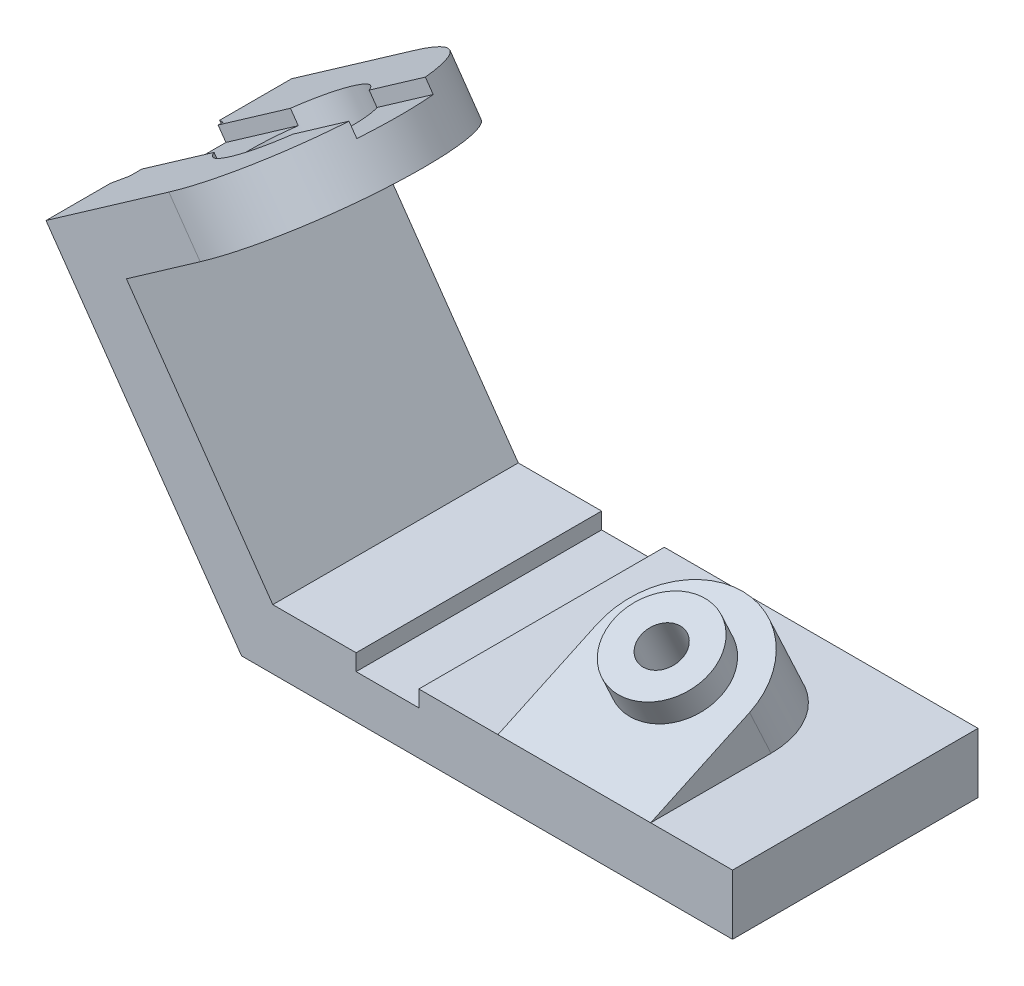
ISO-10303-21;
HEADER;
FILE_DESCRIPTION(('STEP AP214'),'2;1');
FILE_NAME('part.step','',(''),(''),'','','');
FILE_SCHEMA(('AUTOMOTIVE_DESIGN { 1 0 10303 214 1 1 1 1 }'));
ENDSEC;
DATA;
#1=APPLICATION_CONTEXT('core data for automotive mechanical design processes');
#2=APPLICATION_PROTOCOL_DEFINITION('international standard','automotive_design',2000,#1);
#3=PRODUCT_CONTEXT('',#1,'mechanical');
#4=PRODUCT('Part','Part','',(#3));
#5=PRODUCT_RELATED_PRODUCT_CATEGORY('part','',(#4));
#6=PRODUCT_DEFINITION_FORMATION('','',#4);
#7=PRODUCT_DEFINITION_CONTEXT('part definition',#1,'design');
#8=PRODUCT_DEFINITION('design','',#6,#7);
#9=PRODUCT_DEFINITION_SHAPE('','',#8);
#10=(LENGTH_UNIT() NAMED_UNIT(*) SI_UNIT(.MILLI.,.METRE.));
#11=(NAMED_UNIT(*) PLANE_ANGLE_UNIT() SI_UNIT($,.RADIAN.));
#12=(NAMED_UNIT(*) SI_UNIT($,.STERADIAN.) SOLID_ANGLE_UNIT());
#13=UNCERTAINTY_MEASURE_WITH_UNIT(LENGTH_MEASURE(1.E-05),#10,'distance_accuracy_value','');
#14=(GEOMETRIC_REPRESENTATION_CONTEXT(3) GLOBAL_UNCERTAINTY_ASSIGNED_CONTEXT((#13)) GLOBAL_UNIT_ASSIGNED_CONTEXT((#10,
#11,#12)) REPRESENTATION_CONTEXT('',''));
#15=CARTESIAN_POINT('',(0.,0.,0.));
#16=DIRECTION('',(0.,0.,1.));
#17=DIRECTION('',(1.,0.,0.));
#18=AXIS2_PLACEMENT_3D('',#15,#16,#17);
#19=CARTESIAN_POINT('',(-143.675709569523,115.012687135847,-45.));
#20=DIRECTION('',(-0.57357643635105,0.819152044288989,0.));
#21=DIRECTION('',(-0.819152044288989,-0.57357643635105,0.));
#22=AXIS2_PLACEMENT_3D('',#19,#20,#21);
#23=PLANE('',#22);
#24=DIRECTION('',(0.,0.,-1.));
#25=VECTOR('',#24,1.);
#26=CARTESIAN_POINT('',(-157.601294322436,105.261887717879,-15.7753642615069));
#27=LINE('',#26,#25);
#28=CARTESIAN_POINT('',(-157.601294322436,105.261887717879,-14.));
#29=VERTEX_POINT('',#28);
#30=CARTESIAN_POINT('',(-157.601294322436,105.261887717879,-15.7753642615069));
#31=VERTEX_POINT('',#30);
#32=EDGE_CURVE('E339',#29,#31,#27,.T.);
#33=ORIENTED_EDGE('',*,*,#32,.F.);
#34=DIRECTION('',(0.819152044288989,0.57357643635105,0.));
#35=VECTOR('',#34,1.);
#36=CARTESIAN_POINT('',(-101.306148094227,144.68017347149,-14.));
#37=LINE('',#36,#35);
#38=CARTESIAN_POINT('',(-131.072166550332,123.837782966035,-14.));
#39=VERTEX_POINT('',#38);
#40=EDGE_CURVE('E241',#29,#39,#37,.T.);
#41=ORIENTED_EDGE('',*,*,#40,.T.);
#42=CARTESIAN_POINT('',(-116.643692107987,133.940709535431,0.));
#43=DIRECTION('',(-0.573576436351042,0.819152044288995,0.));
#44=DIRECTION('',(-0.819152044288995,-0.573576436351042,0.));
#45=AXIS2_PLACEMENT_3D('',#42,#43,#44);
#46=CIRCLE('',#45,22.5);
#47=CARTESIAN_POINT('',(-102.215217665642,144.043636104827,-14.));
#48=VERTEX_POINT('',#47);
#49=EDGE_CURVE('E294',#48,#39,#46,.T.);
#50=ORIENTED_EDGE('',*,*,#49,.F.);
#51=DIRECTION('',(0.819152044288989,0.57357643635105,0.));
#52=VECTOR('',#51,1.);
#53=CARTESIAN_POINT('',(-101.306148094227,144.68017347149,-14.));
#54=LINE('',#53,#52);
#55=CARTESIAN_POINT('',(-81.6111726286328,158.470743757354,-14.));
#56=VERTEX_POINT('',#55);
#57=EDGE_CURVE('E260',#48,#56,#54,.T.);
#58=ORIENTED_EDGE('',*,*,#57,.T.);
#59=CARTESIAN_POINT('',(-116.643692107987,133.940709535431,0.));
#60=DIRECTION('',(-0.573576436351042,0.819152044288995,0.));
#61=DIRECTION('',(-0.819152044288995,-0.573576436351042,0.));
#62=AXIS2_PLACEMENT_3D('',#59,#60,#61);
#63=CIRCLE('',#62,45.);
#64=CARTESIAN_POINT('',(-116.643692107987,133.940709535431,-45.));
#65=VERTEX_POINT('',#64);
#66=EDGE_CURVE('E309',#65,#56,#63,.F.);
#67=ORIENTED_EDGE('',*,*,#66,.F.);
#68=DIRECTION('',(-0.819152044288989,-0.57357643635105,0.));
#69=VECTOR('',#68,1.);
#70=CARTESIAN_POINT('',(-143.675709569523,115.012687135847,-45.));
#71=LINE('',#70,#69);
#72=CARTESIAN_POINT('',(-161.697054543881,102.394005536124,-45.));
#73=VERTEX_POINT('',#72);
#74=EDGE_CURVE('E384',#65,#73,#71,.T.);
#75=ORIENTED_EDGE('',*,*,#74,.T.);
#76=DIRECTION('',(0.,0.,-1.));
#77=VECTOR('',#76,1.);
#78=CARTESIAN_POINT('',(-161.697054543881,102.394005536124,-45.));
#79=LINE('',#78,#77);
#80=CARTESIAN_POINT('',(-161.697054543881,102.394005536124,-18.662115607455));
#81=VERTEX_POINT('',#80);
#82=EDGE_CURVE('E377',#81,#73,#79,.T.);
#83=ORIENTED_EDGE('',*,*,#82,.F.);
#84=DIRECTION('',(-0.709406479916221,-0.496731764892155,-0.500000000000001));
#85=VECTOR('',#84,1.);
#86=CARTESIAN_POINT('',(-161.697054543881,102.394005536124,-18.662115607455));
#87=LINE('',#86,#85);
#88=EDGE_CURVE('E342',#31,#81,#87,.T.);
#89=ORIENTED_EDGE('',*,*,#88,.F.);
#90=EDGE_LOOP('',(#33,#41,#50,#58,#67,#75,#83,#89));
#91=FACE_BOUND('',#90,.T.);
#92=ADVANCED_FACE('F44',(#91),#23,.T.);
#93=DIRECTION('',(0.819152044288989,0.57357643635105,0.));
#94=VECTOR('',#93,1.);
#95=CARTESIAN_POINT('',(-101.306148094227,144.68017347149,14.));
#96=LINE('',#95,#94);
#97=CARTESIAN_POINT('',(-157.601294322436,105.261887717879,14.));
#98=VERTEX_POINT('',#97);
#99=CARTESIAN_POINT('',(-131.072166550331,123.837782966035,14.));
#100=VERTEX_POINT('',#99);
#101=EDGE_CURVE('E280',#98,#100,#96,.T.);
#102=ORIENTED_EDGE('',*,*,#101,.F.);
#103=CARTESIAN_POINT('',(-157.601294322436,105.261887717879,18.4511330465968));
#104=VERTEX_POINT('',#103);
#105=EDGE_CURVE('E246',#104,#98,#27,.T.);
#106=ORIENTED_EDGE('',*,*,#105,.F.);
#107=DIRECTION('',(0.709406479916222,0.496731764892155,-0.500000000000001));
#108=VECTOR('',#107,1.);
#109=CARTESIAN_POINT('',(-157.601294322436,105.261887717879,18.4511330465968));
#110=LINE('',#109,#108);
#111=CARTESIAN_POINT('',(-161.697054543881,102.394005536124,21.337884392545));
#112=VERTEX_POINT('',#111);
#113=EDGE_CURVE('E335',#112,#104,#110,.T.);
#114=ORIENTED_EDGE('',*,*,#113,.F.);
#115=CARTESIAN_POINT('',(-161.697054543881,102.394005536124,45.));
#116=VERTEX_POINT('',#115);
#117=EDGE_CURVE('E378',#116,#112,#79,.T.);
#118=ORIENTED_EDGE('',*,*,#117,.F.);
#119=DIRECTION('',(-0.819152044288989,-0.57357643635105,0.));
#120=VECTOR('',#119,1.);
#121=CARTESIAN_POINT('',(-143.675709569523,115.012687135847,45.));
#122=LINE('',#121,#120);
#123=CARTESIAN_POINT('',(-116.643692107986,133.940709535431,44.9999999999999));
#124=VERTEX_POINT('',#123);
#125=EDGE_CURVE('E374',#124,#116,#122,.T.);
#126=ORIENTED_EDGE('',*,*,#125,.F.);
#127=CARTESIAN_POINT('',(-81.6111726286329,158.470743757354,14.));
#128=VERTEX_POINT('',#127);
#129=EDGE_CURVE('E320',#128,#124,#63,.F.);
#130=ORIENTED_EDGE('',*,*,#129,.F.);
#131=DIRECTION('',(0.819152044288989,0.57357643635105,0.));
#132=VECTOR('',#131,1.);
#133=CARTESIAN_POINT('',(-101.306148094227,144.68017347149,14.));
#134=LINE('',#133,#132);
#135=CARTESIAN_POINT('',(-102.215217665642,144.043636104827,14.));
#136=VERTEX_POINT('',#135);
#137=EDGE_CURVE('E270',#136,#128,#134,.T.);
#138=ORIENTED_EDGE('',*,*,#137,.F.);
#139=EDGE_CURVE('E316',#100,#136,#46,.T.);
#140=ORIENTED_EDGE('',*,*,#139,.F.);
#141=EDGE_LOOP('',(#102,#106,#114,#118,#126,#130,#138,#140));
#142=FACE_BOUND('',#141,.T.);
#143=ADVANCED_FACE('F566',(#142),#23,.T.);
#144=CARTESIAN_POINT('',(-26.6860526778643,-81.7044536889768,-15.7753642615069));
#145=DIRECTION('',(0.819152044288989,0.57357643635105,0.));
#146=DIRECTION('',(-0.57357643635105,0.819152044288989,0.));
#147=AXIS2_PLACEMENT_3D('',#144,#145,#146);
#148=PLANE('',#147);
#149=DIRECTION('',(-0.57357643635105,0.819152044288989,0.));
#150=VECTOR('',#149,1.);
#151=CARTESIAN_POINT('',(-154.733412140681,101.166127496434,-14.));
#152=LINE('',#151,#150);
#153=CARTESIAN_POINT('',(-154.733412140681,101.166127496434,-14.));
#154=VERTEX_POINT('',#153);
#155=EDGE_CURVE('E303',#154,#29,#152,.T.);
#156=ORIENTED_EDGE('',*,*,#155,.T.);
#157=ORIENTED_EDGE('',*,*,#32,.T.);
#158=DIRECTION('',(-0.57357643635105,0.819152044288989,0.));
#159=VECTOR('',#158,1.);
#160=CARTESIAN_POINT('',(-26.6860526778643,-81.7044536889768,-15.7753642615069));
#161=LINE('',#160,#159);
#162=CARTESIAN_POINT('',(-83.8961270561927,0.,-15.7753642615069));
#163=VERTEX_POINT('',#162);
#164=EDGE_CURVE('E347',#163,#31,#161,.T.);
#165=ORIENTED_EDGE('',*,*,#164,.F.);
#166=DIRECTION('',(0.,0.,-1.));
#167=VECTOR('',#166,1.);
#168=CARTESIAN_POINT('',(-83.8961270561927,0.,0.));
#169=LINE('',#168,#167);
#170=CARTESIAN_POINT('',(-83.8961270561927,0.,18.4511330465968));
#171=VERTEX_POINT('',#170);
#172=EDGE_CURVE('E361',#171,#163,#169,.T.);
#173=ORIENTED_EDGE('',*,*,#172,.F.);
#174=DIRECTION('',(-0.57357643635105,0.819152044288989,0.));
#175=VECTOR('',#174,1.);
#176=CARTESIAN_POINT('',(-26.6860526778643,-81.7044536889768,18.4511330465968));
#177=LINE('',#176,#175);
#178=EDGE_CURVE('E346',#171,#104,#177,.T.);
#179=ORIENTED_EDGE('',*,*,#178,.T.);
#180=ORIENTED_EDGE('',*,*,#105,.T.);
#181=DIRECTION('',(-0.57357643635105,0.819152044288989,0.));
#182=VECTOR('',#181,1.);
#183=CARTESIAN_POINT('',(-154.733412140681,101.166127496434,14.));
#184=LINE('',#183,#182);
#185=CARTESIAN_POINT('',(-154.733412140681,101.166127496434,14.));
#186=VERTEX_POINT('',#185);
#187=EDGE_CURVE('E225',#186,#98,#184,.T.);
#188=ORIENTED_EDGE('',*,*,#187,.F.);
#189=DIRECTION('',(0.,0.,1.));
#190=VECTOR('',#189,1.);
#191=CARTESIAN_POINT('',(-154.733412140681,101.166127496434,0.));
#192=LINE('',#191,#190);
#193=EDGE_CURVE('E232',#154,#186,#192,.T.);
#194=ORIENTED_EDGE('',*,*,#193,.F.);
#195=EDGE_LOOP('',(#156,#157,#165,#173,#179,#180,#188,#194));
#196=FACE_BOUND('',#195,.T.);
#197=ADVANCED_FACE('F244',(#196),#148,.F.);
#198=CARTESIAN_POINT('',(-105.172163380966,117.557668649651,0.));
#199=DIRECTION('',(-0.573576436351041,0.819152044288995,0.));
#200=DIRECTION('',(-0.819152044288995,-0.573576436351041,0.));
#201=AXIS2_PLACEMENT_3D('',#198,#199,#200);
#202=CYLINDRICAL_SURFACE('',#201,45.);
#203=DIRECTION('',(-0.57357643635105,0.819152044288989,0.));
#204=VECTOR('',#203,1.);
#205=CARTESIAN_POINT('',(-78.7432904468776,154.374983535909,-14.));
#206=LINE('',#205,#204);
#207=CARTESIAN_POINT('',(-78.7432904468776,154.374983535909,-14.));
#208=VERTEX_POINT('',#207);
#209=EDGE_CURVE('E281',#208,#56,#206,.T.);
#210=ORIENTED_EDGE('',*,*,#209,.F.);
#211=CARTESIAN_POINT('',(-113.775809926232,129.844949313986,0.));
#212=DIRECTION('',(-0.57357643635105,0.819152044288989,0.));
#213=DIRECTION('',(-0.819152044288989,-0.57357643635105,0.));
#214=AXIS2_PLACEMENT_3D('',#211,#212,#213);
#215=CIRCLE('',#214,45.);
#216=CARTESIAN_POINT('',(-78.7432904468776,154.374983535909,14.));
#217=VERTEX_POINT('',#216);
#218=EDGE_CURVE('E264',#217,#208,#215,.T.);
#219=ORIENTED_EDGE('',*,*,#218,.F.);
#220=DIRECTION('',(-0.57357643635105,0.819152044288989,0.));
#221=VECTOR('',#220,1.);
#222=CARTESIAN_POINT('',(-78.7432904468776,154.374983535909,14.));
#223=LINE('',#222,#221);
#224=EDGE_CURVE('E284',#217,#128,#223,.T.);
#225=ORIENTED_EDGE('',*,*,#224,.T.);
#226=ORIENTED_EDGE('',*,*,#129,.T.);
#227=DIRECTION('',(-0.573576436351041,0.819152044288995,0.));
#228=VECTOR('',#227,1.);
#229=CARTESIAN_POINT('',(-105.172163380966,117.557668649651,44.9999999999999));
#230=LINE('',#229,#228);
#231=CARTESIAN_POINT('',(-105.172163380966,117.557668649651,44.9999999999999));
#232=VERTEX_POINT('',#231);
#233=EDGE_CURVE('E324',#232,#124,#230,.T.);
#234=ORIENTED_EDGE('',*,*,#233,.F.);
#235=CARTESIAN_POINT('',(-105.172163380966,117.557668649651,0.));
#236=DIRECTION('',(-0.573576436351042,0.819152044288995,0.));
#237=DIRECTION('',(-0.819152044288995,-0.573576436351042,0.));
#238=AXIS2_PLACEMENT_3D('',#235,#236,#237);
#239=CIRCLE('',#238,45.);
#240=CARTESIAN_POINT('',(-105.172163380966,117.557668649651,-45.));
#241=VERTEX_POINT('',#240);
#242=EDGE_CURVE('E304',#241,#232,#239,.F.);
#243=ORIENTED_EDGE('',*,*,#242,.F.);
#244=DIRECTION('',(-0.573576436351041,0.819152044288995,0.));
#245=VECTOR('',#244,1.);
#246=CARTESIAN_POINT('',(-105.172163380966,117.557668649651,-45.));
#247=LINE('',#246,#245);
#248=EDGE_CURVE('E315',#241,#65,#247,.T.);
#249=ORIENTED_EDGE('',*,*,#248,.T.);
#250=ORIENTED_EDGE('',*,*,#66,.T.);
#251=EDGE_LOOP('',(#210,#219,#225,#226,#234,#243,#249,#250));
#252=FACE_BOUND('',#251,.T.);
#253=ADVANCED_FACE('F577',(#252),#202,.T.);
#254=CARTESIAN_POINT('',(-105.172163380966,117.557668649651,0.));
#255=DIRECTION('',(-0.573576436351041,0.819152044288995,0.));
#256=DIRECTION('',(-0.819152044288995,-0.573576436351041,0.));
#257=AXIS2_PLACEMENT_3D('',#254,#255,#256);
#258=CYLINDRICAL_SURFACE('',#257,22.5);
#259=CARTESIAN_POINT('',(-109.760774871774,124.110885003963,0.));
#260=DIRECTION('',(-0.573576436351042,0.819152044288995,0.));
#261=DIRECTION('',(-0.819152044288995,-0.573576436351042,0.));
#262=AXIS2_PLACEMENT_3D('',#259,#260,#261);
#263=CIRCLE('',#262,22.5);
#264=CARTESIAN_POINT('',(-128.191695868276,111.205415186065,0.));
#265=VERTEX_POINT('',#264);
#266=EDGE_CURVE('E290',#265,#265,#263,.T.);
#267=ORIENTED_EDGE('',*,*,#266,.F.);
#268=EDGE_LOOP('',(#267));
#269=FACE_BOUND('',#268,.T.);
#270=DIRECTION('',(-0.57357643635105,0.819152044288989,0.));
#271=VECTOR('',#270,1.);
#272=CARTESIAN_POINT('',(-128.204284368576,119.74202274459,-14.));
#273=LINE('',#272,#271);
#274=CARTESIAN_POINT('',(-128.204284368576,119.74202274459,-14.));
#275=VERTEX_POINT('',#274);
#276=EDGE_CURVE('E251',#275,#39,#273,.T.);
#277=ORIENTED_EDGE('',*,*,#276,.F.);
#278=CARTESIAN_POINT('',(-113.775809926232,129.844949313986,0.));
#279=DIRECTION('',(-0.57357643635105,0.819152044288989,0.));
#280=DIRECTION('',(-0.819152044288989,-0.57357643635105,0.));
#281=AXIS2_PLACEMENT_3D('',#278,#279,#280);
#282=CIRCLE('',#281,22.5);
#283=CARTESIAN_POINT('',(-128.204284368576,119.74202274459,14.));
#284=VERTEX_POINT('',#283);
#285=EDGE_CURVE('E231',#284,#275,#282,.F.);
#286=ORIENTED_EDGE('',*,*,#285,.F.);
#287=DIRECTION('',(-0.57357643635105,0.819152044288989,0.));
#288=VECTOR('',#287,1.);
#289=CARTESIAN_POINT('',(-128.204284368576,119.74202274459,14.));
#290=LINE('',#289,#288);
#291=EDGE_CURVE('E228',#284,#100,#290,.T.);
#292=ORIENTED_EDGE('',*,*,#291,.T.);
#293=ORIENTED_EDGE('',*,*,#139,.T.);
#294=DIRECTION('',(-0.57357643635105,0.819152044288989,0.));
#295=VECTOR('',#294,1.);
#296=CARTESIAN_POINT('',(-99.3473354838869,139.947875883382,14.));
#297=LINE('',#296,#295);
#298=CARTESIAN_POINT('',(-99.3473354838869,139.947875883382,14.));
#299=VERTEX_POINT('',#298);
#300=EDGE_CURVE('E269',#299,#136,#297,.T.);
#301=ORIENTED_EDGE('',*,*,#300,.F.);
#302=CARTESIAN_POINT('',(-113.775809926232,129.844949313986,0.));
#303=DIRECTION('',(-0.57357643635105,0.819152044288989,0.));
#304=DIRECTION('',(-0.819152044288989,-0.57357643635105,0.));
#305=AXIS2_PLACEMENT_3D('',#302,#303,#304);
#306=CIRCLE('',#305,22.5);
#307=CARTESIAN_POINT('',(-99.3473354838869,139.947875883382,-14.));
#308=VERTEX_POINT('',#307);
#309=EDGE_CURVE('E256',#308,#299,#306,.F.);
#310=ORIENTED_EDGE('',*,*,#309,.F.);
#311=DIRECTION('',(-0.57357643635105,0.819152044288989,0.));
#312=VECTOR('',#311,1.);
#313=CARTESIAN_POINT('',(-99.3473354838869,139.947875883382,-14.));
#314=LINE('',#313,#312);
#315=EDGE_CURVE('E276',#308,#48,#314,.T.);
#316=ORIENTED_EDGE('',*,*,#315,.T.);
#317=ORIENTED_EDGE('',*,*,#49,.T.);
#318=EDGE_LOOP('',(#277,#286,#292,#293,#301,#310,#316,#317));
#319=FACE_BOUND('',#318,.T.);
#320=ADVANCED_FACE('F548',(#269,#319),#258,.F.);
#321=CARTESIAN_POINT('',(-42.3695614752969,-29.6674863356429,0.));
#322=DIRECTION('',(0.819152044288989,0.57357643635105,0.));
#323=DIRECTION('',(-0.57357643635105,0.819152044288989,0.));
#324=AXIS2_PLACEMENT_3D('',#321,#322,#323);
#325=PLANE('',#324);
#326=DIRECTION('',(0.57357643635105,-0.819152044288989,0.));
#327=VECTOR('',#326,1.);
#328=CARTESIAN_POINT('',(-71.9786550256422,12.6186815997231,-45.));
#329=LINE('',#328,#327);
#330=CARTESIAN_POINT('',(-132.204180842502,98.6296462500668,-45.));
#331=VERTEX_POINT('',#330);
#332=CARTESIAN_POINT('',(-78.5475248878617,22.,-45.));
#333=VERTEX_POINT('',#332);
#334=EDGE_CURVE('E370',#331,#333,#329,.T.);
#335=ORIENTED_EDGE('',*,*,#334,.F.);
#336=DIRECTION('',(0.,0.,1.));
#337=VECTOR('',#336,1.);
#338=CARTESIAN_POINT('',(-132.204180842502,98.6296462500668,0.));
#339=LINE('',#338,#337);
#340=CARTESIAN_POINT('',(-132.204180842502,98.6296462500668,45.));
#341=VERTEX_POINT('',#340);
#342=EDGE_CURVE('E328',#331,#341,#339,.T.);
#343=ORIENTED_EDGE('',*,*,#342,.T.);
#344=DIRECTION('',(-0.57357643635105,0.819152044288989,0.));
#345=VECTOR('',#344,1.);
#346=CARTESIAN_POINT('',(-143.675709569523,115.012687135847,45.));
#347=LINE('',#346,#345);
#348=CARTESIAN_POINT('',(-78.5475248878617,22.,45.));
#349=VERTEX_POINT('',#348);
#350=EDGE_CURVE('E366',#349,#341,#347,.T.);
#351=ORIENTED_EDGE('',*,*,#350,.F.);
#352=DIRECTION('',(0.,0.,-1.));
#353=VECTOR('',#352,1.);
#354=CARTESIAN_POINT('',(-78.5475248878617,22.,0.));
#355=LINE('',#354,#353);
#356=EDGE_CURVE('E388',#349,#333,#355,.T.);
#357=ORIENTED_EDGE('',*,*,#356,.T.);
#358=EDGE_LOOP('',(#335,#343,#351,#357));
#359=FACE_BOUND('',#358,.T.);
#360=ADVANCED_FACE('F684',(#359),#325,.T.);
#361=CARTESIAN_POINT('',(-60.3909064496547,-42.286167935366,0.));
#362=DIRECTION('',(0.819152044288989,0.57357643635105,0.));
#363=DIRECTION('',(-0.57357643635105,0.819152044288989,0.));
#364=AXIS2_PLACEMENT_3D('',#361,#362,#363);
#365=PLANE('',#364);
#366=DIRECTION('',(0.57357643635105,-0.819152044288989,0.));
#367=VECTOR('',#366,1.);
#368=CARTESIAN_POINT('',(-90.,0.,-45.));
#369=LINE('',#368,#367);
#370=CARTESIAN_POINT('',(-90.,0.,-45.));
#371=VERTEX_POINT('',#370);
#372=EDGE_CURVE('E371',#73,#371,#369,.T.);
#373=ORIENTED_EDGE('',*,*,#372,.T.);
#374=DIRECTION('',(0.,0.,1.));
#375=VECTOR('',#374,1.);
#376=CARTESIAN_POINT('',(-90.,0.,-45.));
#377=LINE('',#376,#375);
#378=CARTESIAN_POINT('',(-90.,0.,-18.662115607455));
#379=VERTEX_POINT('',#378);
#380=EDGE_CURVE('E491',#371,#379,#377,.T.);
#381=ORIENTED_EDGE('',*,*,#380,.T.);
#382=DIRECTION('',(-0.57357643635105,0.819152044288989,0.));
#383=VECTOR('',#382,1.);
#384=CARTESIAN_POINT('',(-60.3909064496547,-42.286167935366,-18.6621156074551));
#385=LINE('',#384,#383);
#386=EDGE_CURVE('E12',#379,#81,#385,.T.);
#387=ORIENTED_EDGE('',*,*,#386,.T.);
#388=ORIENTED_EDGE('',*,*,#82,.T.);
#389=EDGE_LOOP('',(#373,#381,#387,#388));
#390=FACE_BOUND('',#389,.T.);
#391=ADVANCED_FACE('F562',(#390),#365,.F.);
#392=CARTESIAN_POINT('',(0.,22.,0.));
#393=DIRECTION('',(0.,1.,0.));
#394=DIRECTION('',(0.,0.,1.));
#395=AXIS2_PLACEMENT_3D('',#392,#393,#394);
#396=PLANE('',#395);
#397=ORIENTED_EDGE('',*,*,#356,.F.);
#398=DIRECTION('',(1.,0.,0.));
#399=VECTOR('',#398,1.);
#400=CARTESIAN_POINT('',(-90.,22.,45.));
#401=LINE('',#400,#399);
#402=CARTESIAN_POINT('',(-48.,22.,45.));
#403=VERTEX_POINT('',#402);
#404=EDGE_CURVE('E477',#349,#403,#401,.T.);
#405=ORIENTED_EDGE('',*,*,#404,.T.);
#406=DIRECTION('',(0.,0.,1.));
#407=VECTOR('',#406,1.);
#408=CARTESIAN_POINT('',(-48.,22.,-45.));
#409=LINE('',#408,#407);
#410=CARTESIAN_POINT('',(-48.,22.,-45.));
#411=VERTEX_POINT('',#410);
#412=EDGE_CURVE('E419',#411,#403,#409,.T.);
#413=ORIENTED_EDGE('',*,*,#412,.F.);
#414=DIRECTION('',(-1.,0.,0.));
#415=VECTOR('',#414,1.);
#416=CARTESIAN_POINT('',(-90.,22.,-45.));
#417=LINE('',#416,#415);
#418=EDGE_CURVE('E485',#411,#333,#417,.T.);
#419=ORIENTED_EDGE('',*,*,#418,.T.);
#420=EDGE_LOOP('',(#397,#405,#413,#419));
#421=FACE_BOUND('',#420,.T.);
#422=ADVANCED_FACE('F648',(#421),#396,.T.);
#423=CARTESIAN_POINT('',(-90.,22.,45.));
#424=DIRECTION('',(0.,0.,-1.));
#425=DIRECTION('',(-1.,0.,0.));
#426=AXIS2_PLACEMENT_3D('',#423,#424,#425);
#427=PLANE('',#426);
#428=ORIENTED_EDGE('',*,*,#125,.T.);
#429=DIRECTION('',(-0.57357643635105,0.819152044288989,0.));
#430=VECTOR('',#429,1.);
#431=CARTESIAN_POINT('',(-161.697054543881,102.394005536124,45.));
#432=LINE('',#431,#430);
#433=CARTESIAN_POINT('',(-90.,0.,45.));
#434=VERTEX_POINT('',#433);
#435=EDGE_CURVE('E365',#434,#116,#432,.T.);
#436=ORIENTED_EDGE('',*,*,#435,.F.);
#437=DIRECTION('',(1.,0.,0.));
#438=VECTOR('',#437,1.);
#439=CARTESIAN_POINT('',(-90.,0.,45.));
#440=LINE('',#439,#438);
#441=CARTESIAN_POINT('',(90.,0.,45.));
#442=VERTEX_POINT('',#441);
#443=EDGE_CURVE('E495',#434,#442,#440,.T.);
#444=ORIENTED_EDGE('',*,*,#443,.T.);
#445=DIRECTION('',(0.,-1.,0.));
#446=VECTOR('',#445,1.);
#447=CARTESIAN_POINT('',(90.,22.,45.));
#448=LINE('',#447,#446);
#449=CARTESIAN_POINT('',(90.,22.,45.));
#450=VERTEX_POINT('',#449);
#451=EDGE_CURVE('E508',#450,#442,#448,.T.);
#452=ORIENTED_EDGE('',*,*,#451,.F.);
#453=CARTESIAN_POINT('',(59.9999999999999,22.,45.));
#454=VERTEX_POINT('',#453);
#455=EDGE_CURVE('E482',#454,#450,#401,.T.);
#456=ORIENTED_EDGE('',*,*,#455,.F.);
#457=DIRECTION('',(1.,0.,0.));
#458=VECTOR('',#457,1.);
#459=CARTESIAN_POINT('',(60.,22.,45.));
#460=LINE('',#459,#458);
#461=CARTESIAN_POINT('',(3.99999999999998,22.,45.));
#462=VERTEX_POINT('',#461);
#463=EDGE_CURVE('E400',#462,#454,#460,.T.);
#464=ORIENTED_EDGE('',*,*,#463,.F.);
#465=CARTESIAN_POINT('',(-25.,22.,45.));
#466=VERTEX_POINT('',#465);
#467=EDGE_CURVE('E481',#466,#462,#401,.T.);
#468=ORIENTED_EDGE('',*,*,#467,.F.);
#469=DIRECTION('',(0.,1.,0.));
#470=VECTOR('',#469,1.);
#471=CARTESIAN_POINT('',(-25.,16.,45.));
#472=LINE('',#471,#470);
#473=CARTESIAN_POINT('',(-25.,16.,45.));
#474=VERTEX_POINT('',#473);
#475=EDGE_CURVE('E471',#474,#466,#472,.T.);
#476=ORIENTED_EDGE('',*,*,#475,.F.);
#477=DIRECTION('',(1.,0.,0.));
#478=VECTOR('',#477,1.);
#479=CARTESIAN_POINT('',(-48.,16.,45.));
#480=LINE('',#479,#478);
#481=CARTESIAN_POINT('',(-48.,16.,45.));
#482=VERTEX_POINT('',#481);
#483=EDGE_CURVE('E444',#482,#474,#480,.T.);
#484=ORIENTED_EDGE('',*,*,#483,.F.);
#485=DIRECTION('',(0.,1.,0.));
#486=VECTOR('',#485,1.);
#487=CARTESIAN_POINT('',(-48.,16.,45.));
#488=LINE('',#487,#486);
#489=EDGE_CURVE('E457',#482,#403,#488,.T.);
#490=ORIENTED_EDGE('',*,*,#489,.T.);
#491=ORIENTED_EDGE('',*,*,#404,.F.);
#492=ORIENTED_EDGE('',*,*,#350,.T.);
#493=DIRECTION('',(-0.819152044288995,-0.573576436351042,0.));
#494=VECTOR('',#493,1.);
#495=CARTESIAN_POINT('',(-89.8346193672038,128.29713258571,44.9999999999999));
#496=LINE('',#495,#494);
#497=EDGE_CURVE('E312',#232,#341,#496,.T.);
#498=ORIENTED_EDGE('',*,*,#497,.F.);
#499=ORIENTED_EDGE('',*,*,#233,.T.);
#500=EDGE_LOOP('',(#428,#436,#444,#452,#456,#464,#468,#476,#484,#490,#491,#492,#498,#499));
#501=FACE_BOUND('',#500,.T.);
#502=ADVANCED_FACE('F46',(#501),#427,.F.);
#503=CARTESIAN_POINT('',(90.,22.,-45.));
#504=DIRECTION('',(-1.,0.,0.));
#505=DIRECTION('',(0.,0.,1.));
#506=AXIS2_PLACEMENT_3D('',#503,#504,#505);
#507=PLANE('',#506);
#508=DIRECTION('',(0.,0.,-1.));
#509=VECTOR('',#508,1.);
#510=CARTESIAN_POINT('',(90.,0.,-45.));
#511=LINE('',#510,#509);
#512=CARTESIAN_POINT('',(90.,0.,-45.));
#513=VERTEX_POINT('',#512);
#514=EDGE_CURVE('E498',#442,#513,#511,.T.);
#515=ORIENTED_EDGE('',*,*,#514,.T.);
#516=DIRECTION('',(0.,-1.,0.));
#517=VECTOR('',#516,1.);
#518=CARTESIAN_POINT('',(90.,22.,-45.));
#519=LINE('',#518,#517);
#520=CARTESIAN_POINT('',(90.,22.,-45.));
#521=VERTEX_POINT('',#520);
#522=EDGE_CURVE('E490',#521,#513,#519,.T.);
#523=ORIENTED_EDGE('',*,*,#522,.F.);
#524=DIRECTION('',(0.,0.,-1.));
#525=VECTOR('',#524,1.);
#526=CARTESIAN_POINT('',(90.,22.,-45.));
#527=LINE('',#526,#525);
#528=EDGE_CURVE('E480',#450,#521,#527,.T.);
#529=ORIENTED_EDGE('',*,*,#528,.F.);
#530=ORIENTED_EDGE('',*,*,#451,.T.);
#531=EDGE_LOOP('',(#515,#523,#529,#530));
#532=FACE_BOUND('',#531,.T.);
#533=ADVANCED_FACE('F653',(#532),#507,.F.);
#534=CARTESIAN_POINT('',(-90.,22.,-45.));
#535=DIRECTION('',(0.,0.,1.));
#536=DIRECTION('',(1.,0.,0.));
#537=AXIS2_PLACEMENT_3D('',#534,#535,#536);
#538=PLANE('',#537);
#539=ORIENTED_EDGE('',*,*,#74,.F.);
#540=ORIENTED_EDGE('',*,*,#248,.F.);
#541=DIRECTION('',(0.819152044288995,0.573576436351042,0.));
#542=VECTOR('',#541,1.);
#543=CARTESIAN_POINT('',(-89.8346193672039,128.29713258571,-45.0000000000001));
#544=LINE('',#543,#542);
#545=EDGE_CURVE('E308',#331,#241,#544,.T.);
#546=ORIENTED_EDGE('',*,*,#545,.F.);
#547=ORIENTED_EDGE('',*,*,#334,.T.);
#548=ORIENTED_EDGE('',*,*,#418,.F.);
#549=DIRECTION('',(0.,1.,0.));
#550=VECTOR('',#549,1.);
#551=CARTESIAN_POINT('',(-48.,16.,-45.));
#552=LINE('',#551,#550);
#553=CARTESIAN_POINT('',(-48.,16.,-45.));
#554=VERTEX_POINT('',#553);
#555=EDGE_CURVE('E463',#554,#411,#552,.T.);
#556=ORIENTED_EDGE('',*,*,#555,.F.);
#557=DIRECTION('',(-1.,0.,0.));
#558=VECTOR('',#557,1.);
#559=CARTESIAN_POINT('',(-48.,16.,-45.));
#560=LINE('',#559,#558);
#561=CARTESIAN_POINT('',(-25.,16.,-45.));
#562=VERTEX_POINT('',#561);
#563=EDGE_CURVE('E453',#562,#554,#560,.T.);
#564=ORIENTED_EDGE('',*,*,#563,.F.);
#565=DIRECTION('',(0.,1.,0.));
#566=VECTOR('',#565,1.);
#567=CARTESIAN_POINT('',(-25.,16.,-45.));
#568=LINE('',#567,#566);
#569=CARTESIAN_POINT('',(-25.,22.,-45.));
#570=VERTEX_POINT('',#569);
#571=EDGE_CURVE('E467',#562,#570,#568,.T.);
#572=ORIENTED_EDGE('',*,*,#571,.T.);
#573=EDGE_CURVE('E486',#521,#570,#417,.T.);
#574=ORIENTED_EDGE('',*,*,#573,.F.);
#575=ORIENTED_EDGE('',*,*,#522,.T.);
#576=DIRECTION('',(-1.,0.,0.));
#577=VECTOR('',#576,1.);
#578=CARTESIAN_POINT('',(-90.,0.,-45.));
#579=LINE('',#578,#577);
#580=EDGE_CURVE('E501',#513,#371,#579,.T.);
#581=ORIENTED_EDGE('',*,*,#580,.T.);
#582=ORIENTED_EDGE('',*,*,#372,.F.);
#583=EDGE_LOOP('',(#539,#540,#546,#547,#548,#556,#564,#572,#574,#575,#581,#582));
#584=FACE_BOUND('',#583,.T.);
#585=ADVANCED_FACE('F646',(#584),#538,.F.);
#586=DIRECTION('',(0.,0.,1.));
#587=VECTOR('',#586,1.);
#588=CARTESIAN_POINT('',(60.,22.,-37.1058213167949));
#589=LINE('',#588,#587);
#590=CARTESIAN_POINT('',(60.,22.,0.864883241500319));
#591=VERTEX_POINT('',#590);
#592=EDGE_CURVE('E409',#591,#454,#589,.T.);
#593=ORIENTED_EDGE('',*,*,#592,.T.);
#594=ORIENTED_EDGE('',*,*,#455,.T.);
#595=ORIENTED_EDGE('',*,*,#528,.T.);
#596=ORIENTED_EDGE('',*,*,#573,.T.);
#597=DIRECTION('',(0.,0.,-1.));
#598=VECTOR('',#597,1.);
#599=CARTESIAN_POINT('',(-25.,22.,-45.));
#600=LINE('',#599,#598);
#601=EDGE_CURVE('E445',#466,#570,#600,.T.);
#602=ORIENTED_EDGE('',*,*,#601,.F.);
#603=ORIENTED_EDGE('',*,*,#467,.T.);
#604=DIRECTION('',(0.,0.,-1.));
#605=VECTOR('',#604,1.);
#606=CARTESIAN_POINT('',(3.99999999999998,22.,-0.853509835328913));
#607=LINE('',#606,#605);
#608=CARTESIAN_POINT('',(3.99999999999998,22.,0.864883241500324));
#609=VERTEX_POINT('',#608);
#610=EDGE_CURVE('E416',#462,#609,#607,.T.);
#611=ORIENTED_EDGE('',*,*,#610,.T.);
#612=CARTESIAN_POINT('',(32.,22.,0.864883241500324));
#613=DIRECTION('',(0.,1.,0.));
#614=DIRECTION('',(0.,0.,1.));
#615=AXIS2_PLACEMENT_3D('',#612,#613,#614);
#616=ELLIPSE('',#615,30.8945817309498,28.);
#617=EDGE_CURVE('E412',#609,#591,#616,.F.);
#618=ORIENTED_EDGE('',*,*,#617,.T.);
#619=EDGE_LOOP('',(#593,#594,#595,#596,#602,#603,#611,#618));
#620=FACE_BOUND('',#619,.T.);
#621=ADVANCED_FACE('F643',(#620),#396,.T.);
#622=CARTESIAN_POINT('',(0.,0.,0.));
#623=DIRECTION('',(0.,1.,0.));
#624=DIRECTION('',(0.,0.,1.));
#625=AXIS2_PLACEMENT_3D('',#622,#623,#624);
#626=PLANE('',#625);
#627=CARTESIAN_POINT('',(32.,0.,-9.39388523790969));
#628=DIRECTION('',(0.,1.,0.));
#629=DIRECTION('',(0.,0.,1.));
#630=AXIS2_PLACEMENT_3D('',#627,#628,#629);
#631=ELLIPSE('',#630,8.27533439221869,7.5);
#632=CARTESIAN_POINT('',(32.,0.,-1.118550845691));
#633=VERTEX_POINT('',#632);
#634=EDGE_CURVE('E395',#633,#633,#631,.T.);
#635=ORIENTED_EDGE('',*,*,#634,.T.);
#636=EDGE_LOOP('',(#635));
#637=FACE_BOUND('',#636,.T.);
#638=ORIENTED_EDGE('',*,*,#172,.T.);
#639=DIRECTION('',(-0.903998769549427,0.,-0.427535056636437));
#640=VECTOR('',#639,1.);
#641=CARTESIAN_POINT('',(-9.23801741370468,0.,19.5332669109443));
#642=LINE('',#641,#640);
#643=EDGE_CURVE('E357',#163,#379,#642,.T.);
#644=ORIENTED_EDGE('',*,*,#643,.T.);
#645=ORIENTED_EDGE('',*,*,#380,.F.);
#646=ORIENTED_EDGE('',*,*,#580,.F.);
#647=ORIENTED_EDGE('',*,*,#514,.F.);
#648=ORIENTED_EDGE('',*,*,#443,.F.);
#649=CARTESIAN_POINT('',(-90.,0.,21.3378843925449));
#650=VERTEX_POINT('',#649);
#651=EDGE_CURVE('E466',#650,#434,#377,.T.);
#652=ORIENTED_EDGE('',*,*,#651,.F.);
#653=DIRECTION('',(0.903998769549427,0.,-0.427535056636436));
#654=VECTOR('',#653,1.);
#655=CARTESIAN_POINT('',(-8.20385641831379,0.,-17.3465918001256));
#656=LINE('',#655,#654);
#657=EDGE_CURVE('E351',#650,#171,#656,.T.);
#658=ORIENTED_EDGE('',*,*,#657,.T.);
#659=EDGE_LOOP('',(#638,#644,#645,#646,#647,#648,#652,#658));
#660=FACE_BOUND('',#659,.T.);
#661=ADVANCED_FACE('F526',(#637,#660),#626,.F.);
#662=CARTESIAN_POINT('',(-48.,16.,-45.));
#663=DIRECTION('',(-1.,0.,0.));
#664=DIRECTION('',(0.,0.,1.));
#665=AXIS2_PLACEMENT_3D('',#662,#663,#664);
#666=PLANE('',#665);
#667=ORIENTED_EDGE('',*,*,#412,.T.);
#668=ORIENTED_EDGE('',*,*,#489,.F.);
#669=DIRECTION('',(0.,0.,1.));
#670=VECTOR('',#669,1.);
#671=CARTESIAN_POINT('',(-48.,16.,-45.));
#672=LINE('',#671,#670);
#673=EDGE_CURVE('E440',#554,#482,#672,.T.);
#674=ORIENTED_EDGE('',*,*,#673,.F.);
#675=ORIENTED_EDGE('',*,*,#555,.T.);
#676=EDGE_LOOP('',(#667,#668,#674,#675));
#677=FACE_BOUND('',#676,.T.);
#678=ADVANCED_FACE('F638',(#677),#666,.F.);
#679=CARTESIAN_POINT('',(-25.,16.,-45.));
#680=DIRECTION('',(1.,0.,0.));
#681=DIRECTION('',(0.,0.,-1.));
#682=AXIS2_PLACEMENT_3D('',#679,#680,#681);
#683=PLANE('',#682);
#684=ORIENTED_EDGE('',*,*,#601,.T.);
#685=ORIENTED_EDGE('',*,*,#571,.F.);
#686=DIRECTION('',(0.,0.,-1.));
#687=VECTOR('',#686,1.);
#688=CARTESIAN_POINT('',(-25.,16.,-45.));
#689=LINE('',#688,#687);
#690=EDGE_CURVE('E449',#474,#562,#689,.T.);
#691=ORIENTED_EDGE('',*,*,#690,.F.);
#692=ORIENTED_EDGE('',*,*,#475,.T.);
#693=EDGE_LOOP('',(#684,#685,#691,#692));
#694=FACE_BOUND('',#693,.T.);
#695=ADVANCED_FACE('F634',(#694),#683,.F.);
#696=CARTESIAN_POINT('',(0.,16.,0.));
#697=DIRECTION('',(0.,1.,0.));
#698=DIRECTION('',(0.,0.,1.));
#699=AXIS2_PLACEMENT_3D('',#696,#697,#698);
#700=PLANE('',#699);
#701=ORIENTED_EDGE('',*,*,#673,.T.);
#702=ORIENTED_EDGE('',*,*,#483,.T.);
#703=ORIENTED_EDGE('',*,*,#690,.T.);
#704=ORIENTED_EDGE('',*,*,#563,.T.);
#705=EDGE_LOOP('',(#701,#702,#703,#704));
#706=FACE_BOUND('',#705,.T.);
#707=ADVANCED_FACE('F620',(#706),#700,.T.);
#708=CARTESIAN_POINT('',(32.,38.904730469628,8.74768851853402));
#709=DIRECTION('',(0.,-0.90630778703665,-0.4226182617407));
#710=DIRECTION('',(0.,0.4226182617407,-0.90630778703665));
#711=AXIS2_PLACEMENT_3D('',#708,#709,#710);
#712=PLANE('',#711);
#713=CARTESIAN_POINT('',(32.,38.904730469628,8.74768851853401));
#714=DIRECTION('',(0.,-0.90630778703665,-0.4226182617407));
#715=DIRECTION('',(0.,0.4226182617407,-0.90630778703665));
#716=AXIS2_PLACEMENT_3D('',#713,#714,#715);
#717=CIRCLE('',#716,17.5);
#718=CARTESIAN_POINT('',(32.,46.3005500500903,-7.11269775460736));
#719=VERTEX_POINT('',#718);
#720=EDGE_CURVE('E405',#719,#719,#717,.F.);
#721=ORIENTED_EDGE('',*,*,#720,.F.);
#722=EDGE_LOOP('',(#721));
#723=FACE_BOUND('',#722,.T.);
#724=ORIENTED_EDGE('',*,*,#463,.T.);
#725=DIRECTION('',(0.,0.4226182617407,-0.90630778703665));
#726=VECTOR('',#725,1.);
#727=CARTESIAN_POINT('',(60.,38.904730469628,8.74768851853402));
#728=LINE('',#727,#726);
#729=CARTESIAN_POINT('',(60.,38.904730469628,8.74768851853402));
#730=VERTEX_POINT('',#729);
#731=EDGE_CURVE('E423',#454,#730,#728,.T.);
#732=ORIENTED_EDGE('',*,*,#731,.T.);
#733=CARTESIAN_POINT('',(32.,38.904730469628,8.74768851853402));
#734=DIRECTION('',(0.,0.90630778703665,0.4226182617407));
#735=DIRECTION('',(0.,0.4226182617407,-0.90630778703665));
#736=AXIS2_PLACEMENT_3D('',#733,#734,#735);
#737=CIRCLE('',#736,28.);
#738=CARTESIAN_POINT('',(3.99999999999998,38.904730469628,8.74768851853402));
#739=VERTEX_POINT('',#738);
#740=EDGE_CURVE('E427',#730,#739,#737,.T.);
#741=ORIENTED_EDGE('',*,*,#740,.T.);
#742=DIRECTION('',(0.,-0.4226182617407,0.90630778703665));
#743=VECTOR('',#742,1.);
#744=CARTESIAN_POINT('',(3.99999999999998,22.,45.));
#745=LINE('',#744,#743);
#746=EDGE_CURVE('E431',#739,#462,#745,.T.);
#747=ORIENTED_EDGE('',*,*,#746,.T.);
#748=EDGE_LOOP('',(#724,#732,#741,#747));
#749=FACE_BOUND('',#748,.T.);
#750=ADVANCED_FACE('F616',(#723,#749),#712,.F.);
#751=CARTESIAN_POINT('',(60.,-59.4284387018878,-37.1058213167949));
#752=DIRECTION('',(1.,0.,0.));
#753=DIRECTION('',(0.,0.,-1.));
#754=AXIS2_PLACEMENT_3D('',#751,#752,#753);
#755=PLANE('',#754);
#756=ORIENTED_EDGE('',*,*,#592,.F.);
#757=DIRECTION('',(0.,0.906307787036649,0.4226182617407));
#758=VECTOR('',#757,1.);
#759=CARTESIAN_POINT('',(60.,-59.4284387018878,-37.1058213167949));
#760=LINE('',#759,#758);
#761=EDGE_CURVE('E435',#591,#730,#760,.T.);
#762=ORIENTED_EDGE('',*,*,#761,.T.);
#763=ORIENTED_EDGE('',*,*,#731,.F.);
#764=EDGE_LOOP('',(#756,#762,#763));
#765=FACE_BOUND('',#764,.T.);
#766=ADVANCED_FACE('F619',(#765),#755,.T.);
#767=CARTESIAN_POINT('',(32.,-59.4284387018878,-37.1058213167949));
#768=DIRECTION('',(0.,0.906307787036649,0.4226182617407));
#769=DIRECTION('',(0.,-0.4226182617407,0.90630778703665));
#770=AXIS2_PLACEMENT_3D('',#767,#768,#769);
#771=CYLINDRICAL_SURFACE('',#770,28.);
#772=ORIENTED_EDGE('',*,*,#617,.F.);
#773=DIRECTION('',(0.,0.906307787036649,0.4226182617407));
#774=VECTOR('',#773,1.);
#775=CARTESIAN_POINT('',(3.99999999999998,-59.4284387018878,-37.1058213167949));
#776=LINE('',#775,#774);
#777=EDGE_CURVE('E413',#609,#739,#776,.T.);
#778=ORIENTED_EDGE('',*,*,#777,.T.);
#779=ORIENTED_EDGE('',*,*,#740,.F.);
#780=ORIENTED_EDGE('',*,*,#761,.F.);
#781=EDGE_LOOP('',(#772,#778,#779,#780));
#782=FACE_BOUND('',#781,.T.);
#783=ADVANCED_FACE('F624',(#782),#771,.T.);
#784=CARTESIAN_POINT('',(3.99999999999998,-76.3331691715158,-0.853509835328913));
#785=DIRECTION('',(-1.,0.,0.));
#786=DIRECTION('',(0.,0.,1.));
#787=AXIS2_PLACEMENT_3D('',#784,#785,#786);
#788=PLANE('',#787);
#789=ORIENTED_EDGE('',*,*,#610,.F.);
#790=ORIENTED_EDGE('',*,*,#746,.F.);
#791=ORIENTED_EDGE('',*,*,#777,.F.);
#792=EDGE_LOOP('',(#789,#790,#791));
#793=FACE_BOUND('',#792,.T.);
#794=ADVANCED_FACE('F611',(#793),#788,.T.);
#795=CARTESIAN_POINT('',(32.,-5.95521627427718,-12.1708481925744));
#796=DIRECTION('',(0.,0.906307787036649,0.4226182617407));
#797=DIRECTION('',(0.,-0.4226182617407,0.90630778703665));
#798=AXIS2_PLACEMENT_3D('',#795,#796,#797);
#799=CYLINDRICAL_SURFACE('',#798,17.5);
#800=CARTESIAN_POINT('',(32.,47.9678083399945,12.973871135941));
#801=DIRECTION('',(0.,0.90630778703665,0.4226182617407));
#802=DIRECTION('',(0.,-0.4226182617407,0.90630778703665));
#803=AXIS2_PLACEMENT_3D('',#800,#801,#802);
#804=CIRCLE('',#803,17.5);
#805=CARTESIAN_POINT('',(32.,40.5719887595323,28.8342574090824));
#806=VERTEX_POINT('',#805);
#807=EDGE_CURVE('E396',#806,#806,#804,.T.);
#808=ORIENTED_EDGE('',*,*,#807,.F.);
#809=EDGE_LOOP('',(#808));
#810=FACE_BOUND('',#809,.T.);
#811=ORIENTED_EDGE('',*,*,#720,.T.);
#812=EDGE_LOOP('',(#811));
#813=FACE_BOUND('',#812,.T.);
#814=ADVANCED_FACE('F608',(#810,#813),#799,.T.);
#815=CARTESIAN_POINT('',(32.,-5.95521627427718,-12.1708481925744));
#816=DIRECTION('',(0.,0.906307787036649,0.4226182617407));
#817=DIRECTION('',(0.,-0.4226182617407,0.90630778703665));
#818=AXIS2_PLACEMENT_3D('',#815,#816,#817);
#819=CYLINDRICAL_SURFACE('',#818,7.5);
#820=CARTESIAN_POINT('',(32.,47.9678083399945,12.973871135941));
#821=DIRECTION('',(0.,0.90630778703665,0.4226182617407));
#822=DIRECTION('',(0.,-0.4226182617407,0.90630778703665));
#823=AXIS2_PLACEMENT_3D('',#820,#821,#822);
#824=CIRCLE('',#823,7.5);
#825=CARTESIAN_POINT('',(32.,44.7981713769393,19.7711795387159));
#826=VERTEX_POINT('',#825);
#827=EDGE_CURVE('E401',#826,#826,#824,.T.);
#828=ORIENTED_EDGE('',*,*,#827,.T.);
#829=EDGE_LOOP('',(#828));
#830=FACE_BOUND('',#829,.T.);
#831=ORIENTED_EDGE('',*,*,#634,.F.);
#832=EDGE_LOOP('',(#831));
#833=FACE_BOUND('',#832,.T.);
#834=ADVANCED_FACE('F606',(#830,#833),#819,.F.);
#835=CARTESIAN_POINT('',(32.,47.9678083399945,12.973871135941));
#836=DIRECTION('',(0.,0.90630778703665,0.4226182617407));
#837=DIRECTION('',(0.,-0.4226182617407,0.90630778703665));
#838=AXIS2_PLACEMENT_3D('',#835,#836,#837);
#839=PLANE('',#838);
#840=ORIENTED_EDGE('',*,*,#827,.F.);
#841=EDGE_LOOP('',(#840));
#842=FACE_BOUND('',#841,.T.);
#843=ORIENTED_EDGE('',*,*,#807,.T.);
#844=EDGE_LOOP('',(#843));
#845=FACE_BOUND('',#844,.T.);
#846=ADVANCED_FACE('F603',(#842,#845),#839,.T.);
#847=DIRECTION('',(0.57357643635105,-0.819152044288989,0.));
#848=VECTOR('',#847,1.);
#849=CARTESIAN_POINT('',(-60.3909064496547,-42.286167935366,21.337884392545));
#850=LINE('',#849,#848);
#851=EDGE_CURVE('E53',#112,#650,#850,.T.);
#852=ORIENTED_EDGE('',*,*,#851,.T.);
#853=ORIENTED_EDGE('',*,*,#651,.T.);
#854=ORIENTED_EDGE('',*,*,#435,.T.);
#855=ORIENTED_EDGE('',*,*,#117,.T.);
#856=EDGE_LOOP('',(#852,#853,#854,#855));
#857=FACE_BOUND('',#856,.T.);
#858=ADVANCED_FACE('F517',(#857),#365,.F.);
#859=CARTESIAN_POINT('',(-30.7818128993093,-84.5723358707321,-18.662115607455));
#860=DIRECTION('',(0.409576022144496,0.286788218175526,-0.866025403784438));
#861=DIRECTION('',(-0.903998769549427,0.,-0.427535056636437));
#862=AXIS2_PLACEMENT_3D('',#859,#860,#861);
#863=PLANE('',#862);
#864=ORIENTED_EDGE('',*,*,#88,.T.);
#865=ORIENTED_EDGE('',*,*,#386,.F.);
#866=ORIENTED_EDGE('',*,*,#643,.F.);
#867=ORIENTED_EDGE('',*,*,#164,.T.);
#868=EDGE_LOOP('',(#864,#865,#866,#867));
#869=FACE_BOUND('',#868,.T.);
#870=ADVANCED_FACE('F558',(#869),#863,.F.);
#871=CARTESIAN_POINT('',(-26.6860526778643,-81.7044536889768,18.4511330465968));
#872=DIRECTION('',(0.409576022144495,0.286788218175525,0.866025403784438));
#873=DIRECTION('',(0.903998769549427,0.,-0.427535056636436));
#874=AXIS2_PLACEMENT_3D('',#871,#872,#873);
#875=PLANE('',#874);
#876=ORIENTED_EDGE('',*,*,#113,.T.);
#877=ORIENTED_EDGE('',*,*,#178,.F.);
#878=ORIENTED_EDGE('',*,*,#657,.F.);
#879=ORIENTED_EDGE('',*,*,#851,.F.);
#880=EDGE_LOOP('',(#876,#877,#878,#879));
#881=FACE_BOUND('',#880,.T.);
#882=ADVANCED_FACE('F524',(#881),#875,.F.);
#883=CARTESIAN_POINT('',(-89.8346193672039,128.29713258571,0.));
#884=DIRECTION('',(-0.573576436351042,0.819152044288995,0.));
#885=DIRECTION('',(-0.819152044288995,-0.573576436351042,0.));
#886=AXIS2_PLACEMENT_3D('',#883,#884,#885);
#887=PLANE('',#886);
#888=ORIENTED_EDGE('',*,*,#342,.F.);
#889=ORIENTED_EDGE('',*,*,#545,.T.);
#890=ORIENTED_EDGE('',*,*,#242,.T.);
#891=ORIENTED_EDGE('',*,*,#497,.T.);
#892=EDGE_LOOP('',(#888,#889,#890,#891));
#893=FACE_BOUND('',#892,.T.);
#894=CARTESIAN_POINT('',(-105.172163380966,117.557668649651,0.));
#895=DIRECTION('',(-0.573576436351042,0.819152044288995,0.));
#896=DIRECTION('',(-0.819152044288995,-0.573576436351042,0.));
#897=AXIS2_PLACEMENT_3D('',#894,#895,#896);
#898=CIRCLE('',#897,11.);
#899=CARTESIAN_POINT('',(-114.182835868145,111.24832784979,0.));
#900=VERTEX_POINT('',#899);
#901=EDGE_CURVE('E299',#900,#900,#898,.F.);
#902=ORIENTED_EDGE('',*,*,#901,.F.);
#903=EDGE_LOOP('',(#902));
#904=FACE_BOUND('',#903,.T.);
#905=ADVANCED_FACE('F676',(#893,#904),#887,.F.);
#906=CARTESIAN_POINT('',(-68.6699824904285,65.4271517690897,-1.20678283309746E-13));
#907=DIRECTION('',(-0.573576436351041,0.819152044288995,0.));
#908=DIRECTION('',(-0.819152044288995,-0.573576436351041,0.));
#909=AXIS2_PLACEMENT_3D('',#906,#907,#908);
#910=CYLINDRICAL_SURFACE('',#909,11.);
#911=ORIENTED_EDGE('',*,*,#901,.T.);
#912=EDGE_LOOP('',(#911));
#913=FACE_BOUND('',#912,.T.);
#914=CARTESIAN_POINT('',(-109.760774871774,124.110885003963,0.));
#915=DIRECTION('',(-0.573576436351042,0.819152044288995,0.));
#916=DIRECTION('',(-0.819152044288995,-0.573576436351042,0.));
#917=AXIS2_PLACEMENT_3D('',#914,#915,#916);
#918=CIRCLE('',#917,11.);
#919=CARTESIAN_POINT('',(-118.771447358953,117.801544204102,0.));
#920=VERTEX_POINT('',#919);
#921=EDGE_CURVE('E295',#920,#920,#918,.T.);
#922=ORIENTED_EDGE('',*,*,#921,.T.);
#923=EDGE_LOOP('',(#922));
#924=FACE_BOUND('',#923,.T.);
#925=ADVANCED_FACE('F591',(#913,#924),#910,.F.);
#926=CARTESIAN_POINT('',(-94.4232308580122,134.850348940022,0.));
#927=DIRECTION('',(-0.573576436351042,0.819152044288995,0.));
#928=DIRECTION('',(-0.819152044288995,-0.573576436351042,0.));
#929=AXIS2_PLACEMENT_3D('',#926,#927,#928);
#930=PLANE('',#929);
#931=ORIENTED_EDGE('',*,*,#921,.F.);
#932=EDGE_LOOP('',(#931));
#933=FACE_BOUND('',#932,.T.);
#934=ORIENTED_EDGE('',*,*,#266,.T.);
#935=EDGE_LOOP('',(#934));
#936=FACE_BOUND('',#935,.T.);
#937=ADVANCED_FACE('F584',(#933,#936),#930,.T.);
#938=CARTESIAN_POINT('',(-98.4382659124713,140.584413250045,-14.));
#939=DIRECTION('',(0.,0.,1.));
#940=DIRECTION('',(1.,0.,0.));
#941=AXIS2_PLACEMENT_3D('',#938,#939,#940);
#942=PLANE('',#941);
#943=ORIENTED_EDGE('',*,*,#57,.F.);
#944=ORIENTED_EDGE('',*,*,#315,.F.);
#945=DIRECTION('',(0.819152044288989,0.57357643635105,0.));
#946=VECTOR('',#945,1.);
#947=CARTESIAN_POINT('',(-98.4382659124713,140.584413250045,-14.));
#948=LINE('',#947,#946);
#949=EDGE_CURVE('E68',#308,#208,#948,.T.);
#950=ORIENTED_EDGE('',*,*,#949,.T.);
#951=ORIENTED_EDGE('',*,*,#209,.T.);
#952=EDGE_LOOP('',(#943,#944,#950,#951));
#953=FACE_BOUND('',#952,.T.);
#954=ADVANCED_FACE('F582',(#953),#942,.T.);
#955=CARTESIAN_POINT('',(-98.4382659124713,140.584413250045,14.));
#956=DIRECTION('',(0.,0.,1.));
#957=DIRECTION('',(1.,0.,0.));
#958=AXIS2_PLACEMENT_3D('',#955,#956,#957);
#959=PLANE('',#958);
#960=ORIENTED_EDGE('',*,*,#137,.T.);
#961=ORIENTED_EDGE('',*,*,#224,.F.);
#962=DIRECTION('',(0.819152044288989,0.57357643635105,0.));
#963=VECTOR('',#962,1.);
#964=CARTESIAN_POINT('',(-98.4382659124713,140.584413250045,14.));
#965=LINE('',#964,#963);
#966=EDGE_CURVE('E259',#299,#217,#965,.T.);
#967=ORIENTED_EDGE('',*,*,#966,.F.);
#968=ORIENTED_EDGE('',*,*,#300,.T.);
#969=EDGE_LOOP('',(#960,#961,#967,#968));
#970=FACE_BOUND('',#969,.T.);
#971=ADVANCED_FACE('F571',(#970),#959,.F.);
#972=CARTESIAN_POINT('',(-98.4382659124713,140.584413250045,0.));
#973=DIRECTION('',(-0.57357643635105,0.819152044288989,0.));
#974=DIRECTION('',(-0.819152044288989,-0.57357643635105,0.));
#975=AXIS2_PLACEMENT_3D('',#972,#973,#974);
#976=PLANE('',#975);
#977=ORIENTED_EDGE('',*,*,#309,.T.);
#978=ORIENTED_EDGE('',*,*,#966,.T.);
#979=ORIENTED_EDGE('',*,*,#218,.T.);
#980=ORIENTED_EDGE('',*,*,#949,.F.);
#981=EDGE_LOOP('',(#977,#978,#979,#980));
#982=FACE_BOUND('',#981,.T.);
#983=ADVANCED_FACE('F580',(#982),#976,.T.);
#984=CARTESIAN_POINT('',(-98.4382659124713,140.584413250045,-14.));
#985=DIRECTION('',(0.,0.,1.));
#986=DIRECTION('',(1.,0.,0.));
#987=AXIS2_PLACEMENT_3D('',#984,#985,#986);
#988=PLANE('',#987);
#989=ORIENTED_EDGE('',*,*,#40,.F.);
#990=ORIENTED_EDGE('',*,*,#155,.F.);
#991=DIRECTION('',(0.819152044288989,0.57357643635105,0.));
#992=VECTOR('',#991,1.);
#993=CARTESIAN_POINT('',(-98.4382659124713,140.584413250045,-14.));
#994=LINE('',#993,#992);
#995=EDGE_CURVE('E237',#154,#275,#994,.T.);
#996=ORIENTED_EDGE('',*,*,#995,.T.);
#997=ORIENTED_EDGE('',*,*,#276,.T.);
#998=EDGE_LOOP('',(#989,#990,#996,#997));
#999=FACE_BOUND('',#998,.T.);
#1000=ADVANCED_FACE('F555',(#999),#988,.T.);
#1001=CARTESIAN_POINT('',(-98.4382659124713,140.584413250045,14.));
#1002=DIRECTION('',(0.,0.,1.));
#1003=DIRECTION('',(1.,0.,0.));
#1004=AXIS2_PLACEMENT_3D('',#1001,#1002,#1003);
#1005=PLANE('',#1004);
#1006=ORIENTED_EDGE('',*,*,#101,.T.);
#1007=ORIENTED_EDGE('',*,*,#291,.F.);
#1008=DIRECTION('',(0.819152044288989,0.57357643635105,0.));
#1009=VECTOR('',#1008,1.);
#1010=CARTESIAN_POINT('',(-98.4382659124713,140.584413250045,14.));
#1011=LINE('',#1010,#1009);
#1012=EDGE_CURVE('E60',#186,#284,#1011,.T.);
#1013=ORIENTED_EDGE('',*,*,#1012,.F.);
#1014=ORIENTED_EDGE('',*,*,#187,.T.);
#1015=EDGE_LOOP('',(#1006,#1007,#1013,#1014));
#1016=FACE_BOUND('',#1015,.T.);
#1017=ADVANCED_FACE('F223',(#1016),#1005,.F.);
#1018=CARTESIAN_POINT('',(-98.4382659124713,140.584413250045,0.));
#1019=DIRECTION('',(-0.57357643635105,0.819152044288989,0.));
#1020=DIRECTION('',(-0.819152044288989,-0.57357643635105,0.));
#1021=AXIS2_PLACEMENT_3D('',#1018,#1019,#1020);
#1022=PLANE('',#1021);
#1023=ORIENTED_EDGE('',*,*,#193,.T.);
#1024=ORIENTED_EDGE('',*,*,#1012,.T.);
#1025=ORIENTED_EDGE('',*,*,#285,.T.);
#1026=ORIENTED_EDGE('',*,*,#995,.F.);
#1027=EDGE_LOOP('',(#1023,#1024,#1025,#1026));
#1028=FACE_BOUND('',#1027,.T.);
#1029=ADVANCED_FACE('F236',(#1028),#1022,.T.);
#1030=CLOSED_SHELL('',(#92,#143,#197,#253,#320,#360,#391,#422,#502,#533,#585,#621,#661,#678,
#695,#707,#750,#766,#783,#794,#814,#834,#846,#858,#870,#882,#905,#925,#937,#954,#971,#983,#1000,
#1017,#1029));
#1031=MANIFOLD_SOLID_BREP('B2',#1030);
#1032=ADVANCED_BREP_SHAPE_REPRESENTATION('',(#18,#1031),#14);
#1033=SHAPE_DEFINITION_REPRESENTATION(#9,#1032);
ENDSEC;
END-ISO-10303-21;
